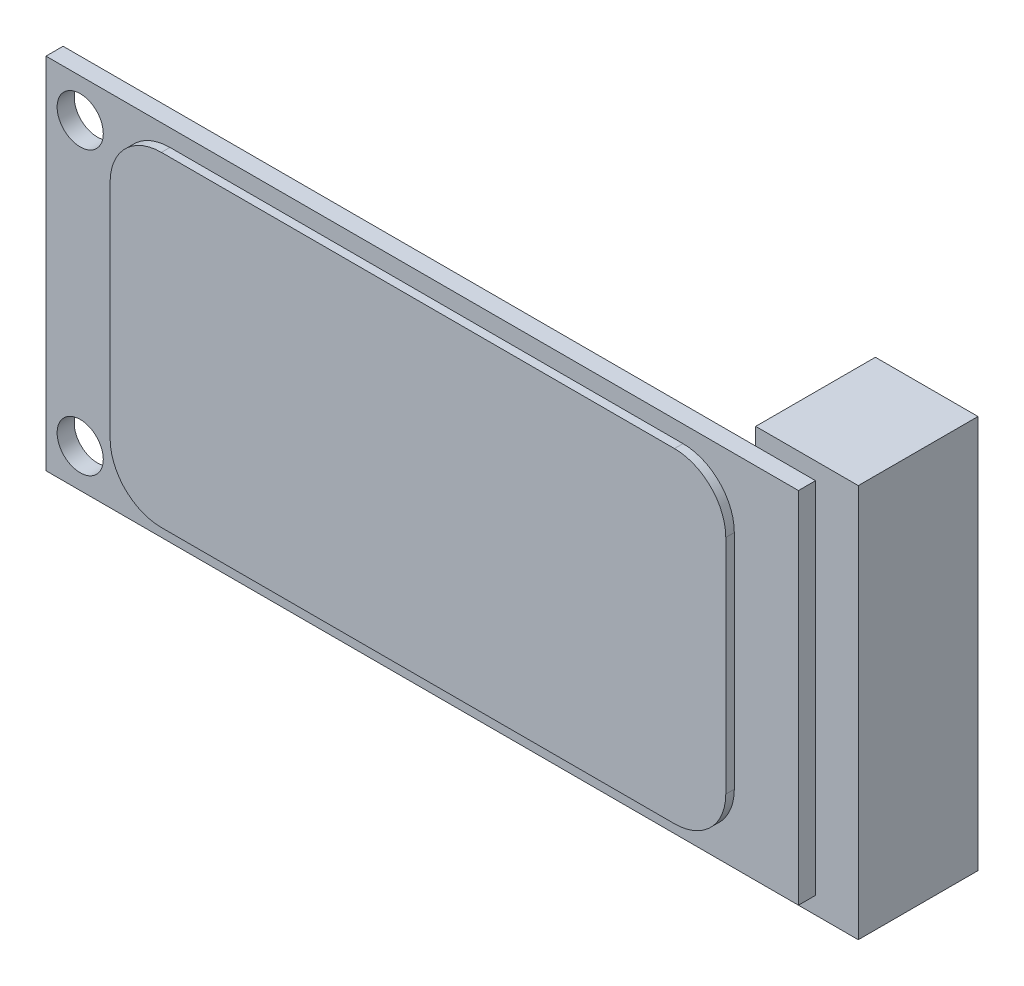
ISO-10303-21;
HEADER;
FILE_DESCRIPTION(('STEP AP214'),'2;1');
FILE_NAME('part.step','',(''),(''),'','','');
FILE_SCHEMA(('AUTOMOTIVE_DESIGN { 1 0 10303 214 1 1 1 1 }'));
ENDSEC;
DATA;
#1=APPLICATION_CONTEXT('core data for automotive mechanical design processes');
#2=APPLICATION_PROTOCOL_DEFINITION('international standard','automotive_design',2000,#1);
#3=PRODUCT_CONTEXT('',#1,'mechanical');
#4=PRODUCT('Part','Part','',(#3));
#5=PRODUCT_RELATED_PRODUCT_CATEGORY('part','',(#4));
#6=PRODUCT_DEFINITION_FORMATION('','',#4);
#7=PRODUCT_DEFINITION_CONTEXT('part definition',#1,'design');
#8=PRODUCT_DEFINITION('design','',#6,#7);
#9=PRODUCT_DEFINITION_SHAPE('','',#8);
#10=(LENGTH_UNIT() NAMED_UNIT(*) SI_UNIT(.MILLI.,.METRE.));
#11=(NAMED_UNIT(*) PLANE_ANGLE_UNIT() SI_UNIT($,.RADIAN.));
#12=(NAMED_UNIT(*) SI_UNIT($,.STERADIAN.) SOLID_ANGLE_UNIT());
#13=UNCERTAINTY_MEASURE_WITH_UNIT(LENGTH_MEASURE(1.E-05),#10,'distance_accuracy_value','');
#14=(GEOMETRIC_REPRESENTATION_CONTEXT(3) GLOBAL_UNCERTAINTY_ASSIGNED_CONTEXT((#13)) GLOBAL_UNIT_ASSIGNED_CONTEXT((#10,
#11,#12)) REPRESENTATION_CONTEXT('',''));
#15=CARTESIAN_POINT('',(0.,0.,0.));
#16=DIRECTION('',(0.,0.,1.));
#17=DIRECTION('',(1.,0.,0.));
#18=AXIS2_PLACEMENT_3D('',#15,#16,#17);
#19=CARTESIAN_POINT('',(0.,0.,0.));
#20=DIRECTION('',(0.,0.,1.));
#21=DIRECTION('',(1.,0.,0.));
#22=AXIS2_PLACEMENT_3D('',#19,#20,#21);
#23=PLANE('',#22);
#24=CARTESIAN_POINT('',(-20.,-8.25,0.));
#25=DIRECTION('',(0.,0.,1.));
#26=DIRECTION('',(1.,0.,0.));
#27=AXIS2_PLACEMENT_3D('',#24,#25,#26);
#28=CIRCLE('',#27,1.35000000000001);
#29=CARTESIAN_POINT('',(-18.65,-8.25,0.));
#30=VERTEX_POINT('',#29);
#31=EDGE_CURVE('E248',#30,#30,#28,.T.);
#32=ORIENTED_EDGE('',*,*,#31,.T.);
#33=EDGE_LOOP('',(#32));
#34=FACE_BOUND('',#33,.T.);
#35=CARTESIAN_POINT('',(-20.,8.24999999999999,0.));
#36=DIRECTION('',(0.,0.,1.));
#37=DIRECTION('',(1.,0.,0.));
#38=AXIS2_PLACEMENT_3D('',#35,#36,#37);
#39=CIRCLE('',#38,1.35);
#40=CARTESIAN_POINT('',(-18.65,8.24999999999999,0.));
#41=VERTEX_POINT('',#40);
#42=EDGE_CURVE('E218',#41,#41,#39,.T.);
#43=ORIENTED_EDGE('',*,*,#42,.T.);
#44=EDGE_LOOP('',(#43));
#45=FACE_BOUND('',#44,.T.);
#46=DIRECTION('',(0.,1.,0.));
#47=VECTOR('',#46,1.);
#48=CARTESIAN_POINT('',(18.5,11.5,0.));
#49=LINE('',#48,#47);
#50=CARTESIAN_POINT('',(18.5,-10.5,0.));
#51=VERTEX_POINT('',#50);
#52=CARTESIAN_POINT('',(18.5,10.5,0.));
#53=VERTEX_POINT('',#52);
#54=EDGE_CURVE('E11',#51,#53,#49,.T.);
#55=ORIENTED_EDGE('',*,*,#54,.F.);
#56=DIRECTION('',(-1.,0.,0.));
#57=VECTOR('',#56,1.);
#58=CARTESIAN_POINT('',(0.,-10.5,0.));
#59=LINE('',#58,#57);
#60=CARTESIAN_POINT('',(-22.,-10.5,0.));
#61=VERTEX_POINT('',#60);
#62=EDGE_CURVE('E254',#51,#61,#59,.T.);
#63=ORIENTED_EDGE('',*,*,#62,.T.);
#64=DIRECTION('',(0.,1.,0.));
#65=VECTOR('',#64,1.);
#66=CARTESIAN_POINT('',(-22.,0.,0.));
#67=LINE('',#66,#65);
#68=CARTESIAN_POINT('',(-22.,10.5,0.));
#69=VERTEX_POINT('',#68);
#70=EDGE_CURVE('E251',#61,#69,#67,.T.);
#71=ORIENTED_EDGE('',*,*,#70,.T.);
#72=DIRECTION('',(-1.,0.,0.));
#73=VECTOR('',#72,1.);
#74=CARTESIAN_POINT('',(0.,10.5,0.));
#75=LINE('',#74,#73);
#76=EDGE_CURVE('E261',#53,#69,#75,.T.);
#77=ORIENTED_EDGE('',*,*,#76,.F.);
#78=EDGE_LOOP('',(#55,#63,#71,#77));
#79=FACE_BOUND('',#78,.T.);
#80=ADVANCED_FACE('F51',(#34,#45,#79),#23,.F.);
#81=CARTESIAN_POINT('',(-22.,0.,1.));
#82=DIRECTION('',(-1.,0.,0.));
#83=DIRECTION('',(0.,0.,1.));
#84=AXIS2_PLACEMENT_3D('',#81,#82,#83);
#85=PLANE('',#84);
#86=ORIENTED_EDGE('',*,*,#70,.F.);
#87=DIRECTION('',(0.,0.,-1.));
#88=VECTOR('',#87,1.);
#89=CARTESIAN_POINT('',(-22.,-10.5,1.));
#90=LINE('',#89,#88);
#91=CARTESIAN_POINT('',(-22.,-10.5,1.));
#92=VERTEX_POINT('',#91);
#93=EDGE_CURVE('E269',#92,#61,#90,.T.);
#94=ORIENTED_EDGE('',*,*,#93,.F.);
#95=DIRECTION('',(0.,1.,0.));
#96=VECTOR('',#95,1.);
#97=CARTESIAN_POINT('',(-22.,0.,1.));
#98=LINE('',#97,#96);
#99=CARTESIAN_POINT('',(-22.,10.5,1.));
#100=VERTEX_POINT('',#99);
#101=EDGE_CURVE('E234',#92,#100,#98,.T.);
#102=ORIENTED_EDGE('',*,*,#101,.T.);
#103=DIRECTION('',(0.,0.,-1.));
#104=VECTOR('',#103,1.);
#105=CARTESIAN_POINT('',(-22.,10.5,1.));
#106=LINE('',#105,#104);
#107=EDGE_CURVE('E245',#100,#69,#106,.T.);
#108=ORIENTED_EDGE('',*,*,#107,.T.);
#109=EDGE_LOOP('',(#86,#94,#102,#108));
#110=FACE_BOUND('',#109,.T.);
#111=ADVANCED_FACE('F351',(#110),#85,.T.);
#112=CARTESIAN_POINT('',(0.,-10.5,1.));
#113=DIRECTION('',(0.,-1.,0.));
#114=DIRECTION('',(0.,0.,-1.));
#115=AXIS2_PLACEMENT_3D('',#112,#113,#114);
#116=PLANE('',#115);
#117=CARTESIAN_POINT('',(22.,-10.5,0.));
#118=VERTEX_POINT('',#117);
#119=EDGE_CURVE('E255',#118,#51,#59,.T.);
#120=ORIENTED_EDGE('',*,*,#119,.F.);
#121=DIRECTION('',(0.,0.,-1.));
#122=VECTOR('',#121,1.);
#123=CARTESIAN_POINT('',(22.,-10.5,1.));
#124=LINE('',#123,#122);
#125=CARTESIAN_POINT('',(22.,-10.5,1.));
#126=VERTEX_POINT('',#125);
#127=EDGE_CURVE('E267',#126,#118,#124,.T.);
#128=ORIENTED_EDGE('',*,*,#127,.F.);
#129=DIRECTION('',(-1.,0.,0.));
#130=VECTOR('',#129,1.);
#131=CARTESIAN_POINT('',(0.,-10.5,1.));
#132=LINE('',#131,#130);
#133=EDGE_CURVE('E237',#126,#92,#132,.T.);
#134=ORIENTED_EDGE('',*,*,#133,.T.);
#135=ORIENTED_EDGE('',*,*,#93,.T.);
#136=ORIENTED_EDGE('',*,*,#62,.F.);
#137=EDGE_LOOP('',(#120,#128,#134,#135,#136));
#138=FACE_BOUND('',#137,.T.);
#139=ADVANCED_FACE('F359',(#138),#116,.T.);
#140=CARTESIAN_POINT('',(22.,0.,1.));
#141=DIRECTION('',(-1.,0.,0.));
#142=DIRECTION('',(0.,0.,1.));
#143=AXIS2_PLACEMENT_3D('',#140,#141,#142);
#144=PLANE('',#143);
#145=DIRECTION('',(0.,1.,0.));
#146=VECTOR('',#145,1.);
#147=CARTESIAN_POINT('',(22.,0.,0.));
#148=LINE('',#147,#146);
#149=CARTESIAN_POINT('',(22.,10.5,0.));
#150=VERTEX_POINT('',#149);
#151=EDGE_CURVE('E258',#118,#150,#148,.T.);
#152=ORIENTED_EDGE('',*,*,#151,.T.);
#153=DIRECTION('',(0.,0.,-1.));
#154=VECTOR('',#153,1.);
#155=CARTESIAN_POINT('',(22.,10.5,1.));
#156=LINE('',#155,#154);
#157=CARTESIAN_POINT('',(22.,10.5,1.));
#158=VERTEX_POINT('',#157);
#159=EDGE_CURVE('E265',#158,#150,#156,.T.);
#160=ORIENTED_EDGE('',*,*,#159,.F.);
#161=DIRECTION('',(0.,1.,0.));
#162=VECTOR('',#161,1.);
#163=CARTESIAN_POINT('',(22.,0.,1.));
#164=LINE('',#163,#162);
#165=EDGE_CURVE('E240',#126,#158,#164,.T.);
#166=ORIENTED_EDGE('',*,*,#165,.F.);
#167=ORIENTED_EDGE('',*,*,#127,.T.);
#168=EDGE_LOOP('',(#152,#160,#166,#167));
#169=FACE_BOUND('',#168,.T.);
#170=ADVANCED_FACE('F371',(#169),#144,.F.);
#171=CARTESIAN_POINT('',(-20.,-8.25,1.));
#172=DIRECTION('',(0.,0.,-1.));
#173=DIRECTION('',(-1.,0.,0.));
#174=AXIS2_PLACEMENT_3D('',#171,#172,#173);
#175=CYLINDRICAL_SURFACE('',#174,1.35000000000001);
#176=CARTESIAN_POINT('',(-20.,-8.25,1.));
#177=DIRECTION('',(0.,0.,1.));
#178=DIRECTION('',(1.,0.,0.));
#179=AXIS2_PLACEMENT_3D('',#176,#177,#178);
#180=CIRCLE('',#179,1.35000000000001);
#181=CARTESIAN_POINT('',(-18.65,-8.25,1.));
#182=VERTEX_POINT('',#181);
#183=EDGE_CURVE('E230',#182,#182,#180,.T.);
#184=ORIENTED_EDGE('',*,*,#183,.T.);
#185=EDGE_LOOP('',(#184));
#186=FACE_BOUND('',#185,.T.);
#187=ORIENTED_EDGE('',*,*,#31,.F.);
#188=EDGE_LOOP('',(#187));
#189=FACE_BOUND('',#188,.T.);
#190=ADVANCED_FACE('F374',(#186,#189),#175,.F.);
#191=CARTESIAN_POINT('',(-20.,8.24999999999999,1.));
#192=DIRECTION('',(0.,0.,-1.));
#193=DIRECTION('',(-1.,0.,0.));
#194=AXIS2_PLACEMENT_3D('',#191,#192,#193);
#195=CYLINDRICAL_SURFACE('',#194,1.35);
#196=CARTESIAN_POINT('',(-20.,8.24999999999999,1.));
#197=DIRECTION('',(0.,0.,1.));
#198=DIRECTION('',(1.,0.,0.));
#199=AXIS2_PLACEMENT_3D('',#196,#197,#198);
#200=CIRCLE('',#199,1.35);
#201=CARTESIAN_POINT('',(-18.65,8.24999999999999,1.));
#202=VERTEX_POINT('',#201);
#203=EDGE_CURVE('E227',#202,#202,#200,.T.);
#204=ORIENTED_EDGE('',*,*,#203,.T.);
#205=EDGE_LOOP('',(#204));
#206=FACE_BOUND('',#205,.T.);
#207=ORIENTED_EDGE('',*,*,#42,.F.);
#208=EDGE_LOOP('',(#207));
#209=FACE_BOUND('',#208,.T.);
#210=ADVANCED_FACE('F369',(#206,#209),#195,.F.);
#211=CARTESIAN_POINT('',(0.,10.5,1.));
#212=DIRECTION('',(0.,-1.,0.));
#213=DIRECTION('',(0.,0.,-1.));
#214=AXIS2_PLACEMENT_3D('',#211,#212,#213);
#215=PLANE('',#214);
#216=EDGE_CURVE('E231',#150,#53,#75,.T.);
#217=ORIENTED_EDGE('',*,*,#216,.T.);
#218=ORIENTED_EDGE('',*,*,#76,.T.);
#219=ORIENTED_EDGE('',*,*,#107,.F.);
#220=DIRECTION('',(-1.,0.,0.));
#221=VECTOR('',#220,1.);
#222=CARTESIAN_POINT('',(0.,10.5,1.));
#223=LINE('',#222,#221);
#224=EDGE_CURVE('E243',#158,#100,#223,.T.);
#225=ORIENTED_EDGE('',*,*,#224,.F.);
#226=ORIENTED_EDGE('',*,*,#159,.T.);
#227=EDGE_LOOP('',(#217,#218,#219,#225,#226));
#228=FACE_BOUND('',#227,.T.);
#229=ADVANCED_FACE('F366',(#228),#215,.F.);
#230=CARTESIAN_POINT('',(0.,0.,1.));
#231=DIRECTION('',(0.,0.,1.));
#232=DIRECTION('',(1.,0.,0.));
#233=AXIS2_PLACEMENT_3D('',#230,#231,#232);
#234=PLANE('',#233);
#235=DIRECTION('',(0.,1.,0.));
#236=VECTOR('',#235,1.);
#237=CARTESIAN_POINT('',(-17.75,-9.50000000000001,1.));
#238=LINE('',#237,#236);
#239=CARTESIAN_POINT('',(-17.75,-6.50000000000001,1.));
#240=VERTEX_POINT('',#239);
#241=CARTESIAN_POINT('',(-17.75,6.5,1.));
#242=VERTEX_POINT('',#241);
#243=EDGE_CURVE('E210',#240,#242,#238,.T.);
#244=ORIENTED_EDGE('',*,*,#243,.T.);
#245=CARTESIAN_POINT('',(-14.75,6.5,1.));
#246=DIRECTION('',(0.,0.,1.));
#247=DIRECTION('',(1.,0.,0.));
#248=AXIS2_PLACEMENT_3D('',#245,#246,#247);
#249=CIRCLE('',#248,3.);
#250=CARTESIAN_POINT('',(-14.75,9.49999999999999,1.));
#251=VERTEX_POINT('',#250);
#252=EDGE_CURVE('E55',#242,#251,#249,.F.);
#253=ORIENTED_EDGE('',*,*,#252,.T.);
#254=DIRECTION('',(1.,0.,0.));
#255=VECTOR('',#254,1.);
#256=CARTESIAN_POINT('',(-17.75,9.49999999999999,1.));
#257=LINE('',#256,#255);
#258=CARTESIAN_POINT('',(15.25,9.49999999999999,1.));
#259=VERTEX_POINT('',#258);
#260=EDGE_CURVE('E197',#251,#259,#257,.T.);
#261=ORIENTED_EDGE('',*,*,#260,.T.);
#262=CARTESIAN_POINT('',(15.25,6.49999999999999,1.));
#263=DIRECTION('',(0.,0.,1.));
#264=DIRECTION('',(1.,0.,0.));
#265=AXIS2_PLACEMENT_3D('',#262,#263,#264);
#266=CIRCLE('',#265,3.);
#267=CARTESIAN_POINT('',(18.25,6.5,1.));
#268=VERTEX_POINT('',#267);
#269=EDGE_CURVE('E299',#259,#268,#266,.F.);
#270=ORIENTED_EDGE('',*,*,#269,.T.);
#271=DIRECTION('',(0.,1.,0.));
#272=VECTOR('',#271,1.);
#273=CARTESIAN_POINT('',(18.25,-9.50000000000001,1.));
#274=LINE('',#273,#272);
#275=CARTESIAN_POINT('',(18.25,-6.50000000000001,1.));
#276=VERTEX_POINT('',#275);
#277=EDGE_CURVE('E200',#276,#268,#274,.T.);
#278=ORIENTED_EDGE('',*,*,#277,.F.);
#279=CARTESIAN_POINT('',(15.25,-6.50000000000001,1.));
#280=DIRECTION('',(0.,0.,1.));
#281=DIRECTION('',(1.,0.,0.));
#282=AXIS2_PLACEMENT_3D('',#279,#280,#281);
#283=CIRCLE('',#282,3.);
#284=CARTESIAN_POINT('',(15.25,-9.50000000000001,1.));
#285=VERTEX_POINT('',#284);
#286=EDGE_CURVE('E301',#276,#285,#283,.F.);
#287=ORIENTED_EDGE('',*,*,#286,.T.);
#288=DIRECTION('',(1.,0.,0.));
#289=VECTOR('',#288,1.);
#290=CARTESIAN_POINT('',(-17.75,-9.50000000000001,1.));
#291=LINE('',#290,#289);
#292=CARTESIAN_POINT('',(-14.75,-9.50000000000001,1.));
#293=VERTEX_POINT('',#292);
#294=EDGE_CURVE('E222',#293,#285,#291,.T.);
#295=ORIENTED_EDGE('',*,*,#294,.F.);
#296=CARTESIAN_POINT('',(-14.75,-6.50000000000001,1.));
#297=DIRECTION('',(0.,0.,1.));
#298=DIRECTION('',(1.,0.,0.));
#299=AXIS2_PLACEMENT_3D('',#296,#297,#298);
#300=CIRCLE('',#299,3.);
#301=EDGE_CURVE('E302',#293,#240,#300,.F.);
#302=ORIENTED_EDGE('',*,*,#301,.T.);
#303=EDGE_LOOP('',(#244,#253,#261,#270,#278,#287,#295,#302));
#304=FACE_BOUND('',#303,.T.);
#305=ORIENTED_EDGE('',*,*,#203,.F.);
#306=EDGE_LOOP('',(#305));
#307=FACE_BOUND('',#306,.T.);
#308=ORIENTED_EDGE('',*,*,#183,.F.);
#309=EDGE_LOOP('',(#308));
#310=FACE_BOUND('',#309,.T.);
#311=ORIENTED_EDGE('',*,*,#101,.F.);
#312=ORIENTED_EDGE('',*,*,#133,.F.);
#313=ORIENTED_EDGE('',*,*,#165,.T.);
#314=ORIENTED_EDGE('',*,*,#224,.T.);
#315=EDGE_LOOP('',(#311,#312,#313,#314));
#316=FACE_BOUND('',#315,.T.);
#317=ADVANCED_FACE('F307',(#304,#307,#310,#316),#234,.T.);
#318=CARTESIAN_POINT('',(-17.75,9.49999999999999,1.5));
#319=DIRECTION('',(0.,1.,0.));
#320=DIRECTION('',(0.,0.,1.));
#321=AXIS2_PLACEMENT_3D('',#318,#319,#320);
#322=PLANE('',#321);
#323=DIRECTION('',(1.,0.,0.));
#324=VECTOR('',#323,1.);
#325=CARTESIAN_POINT('',(-17.75,9.49999999999999,1.5));
#326=LINE('',#325,#324);
#327=CARTESIAN_POINT('',(-14.75,9.49999999999999,1.5));
#328=VERTEX_POINT('',#327);
#329=CARTESIAN_POINT('',(15.25,9.49999999999999,1.5));
#330=VERTEX_POINT('',#329);
#331=EDGE_CURVE('E206',#328,#330,#326,.T.);
#332=ORIENTED_EDGE('',*,*,#331,.T.);
#333=DIRECTION('',(0.,0.,-1.));
#334=VECTOR('',#333,1.);
#335=CARTESIAN_POINT('',(15.25,9.49999999999999,1.));
#336=LINE('',#335,#334);
#337=EDGE_CURVE('E274',#330,#259,#336,.T.);
#338=ORIENTED_EDGE('',*,*,#337,.T.);
#339=ORIENTED_EDGE('',*,*,#260,.F.);
#340=DIRECTION('',(0.,0.,-1.));
#341=VECTOR('',#340,1.);
#342=CARTESIAN_POINT('',(-14.75,9.49999999999999,1.5));
#343=LINE('',#342,#341);
#344=EDGE_CURVE('E272',#251,#328,#343,.F.);
#345=ORIENTED_EDGE('',*,*,#344,.T.);
#346=EDGE_LOOP('',(#332,#338,#339,#345));
#347=FACE_BOUND('',#346,.T.);
#348=ADVANCED_FACE('F310',(#347),#322,.T.);
#349=CARTESIAN_POINT('',(-17.75,-9.50000000000001,1.5));
#350=DIRECTION('',(-1.,0.,0.));
#351=DIRECTION('',(0.,0.,1.));
#352=AXIS2_PLACEMENT_3D('',#349,#350,#351);
#353=PLANE('',#352);
#354=ORIENTED_EDGE('',*,*,#243,.F.);
#355=DIRECTION('',(0.,0.,-1.));
#356=VECTOR('',#355,1.);
#357=CARTESIAN_POINT('',(-17.75,-6.50000000000001,1.5));
#358=LINE('',#357,#356);
#359=CARTESIAN_POINT('',(-17.75,-6.50000000000001,1.5));
#360=VERTEX_POINT('',#359);
#361=EDGE_CURVE('E297',#240,#360,#358,.F.);
#362=ORIENTED_EDGE('',*,*,#361,.T.);
#363=DIRECTION('',(0.,1.,0.));
#364=VECTOR('',#363,1.);
#365=CARTESIAN_POINT('',(-17.75,-9.50000000000001,1.5));
#366=LINE('',#365,#364);
#367=CARTESIAN_POINT('',(-17.75,6.5,1.5));
#368=VERTEX_POINT('',#367);
#369=EDGE_CURVE('E216',#360,#368,#366,.T.);
#370=ORIENTED_EDGE('',*,*,#369,.T.);
#371=DIRECTION('',(0.,0.,-1.));
#372=VECTOR('',#371,1.);
#373=CARTESIAN_POINT('',(-17.75,6.5,1.5));
#374=LINE('',#373,#372);
#375=EDGE_CURVE('E295',#368,#242,#374,.T.);
#376=ORIENTED_EDGE('',*,*,#375,.T.);
#377=EDGE_LOOP('',(#354,#362,#370,#376));
#378=FACE_BOUND('',#377,.T.);
#379=ADVANCED_FACE('F319',(#378),#353,.T.);
#380=CARTESIAN_POINT('',(-17.75,-9.50000000000001,1.5));
#381=DIRECTION('',(0.,1.,0.));
#382=DIRECTION('',(0.,0.,1.));
#383=AXIS2_PLACEMENT_3D('',#380,#381,#382);
#384=PLANE('',#383);
#385=ORIENTED_EDGE('',*,*,#294,.T.);
#386=DIRECTION('',(0.,0.,-1.));
#387=VECTOR('',#386,1.);
#388=CARTESIAN_POINT('',(15.25,-9.50000000000001,1.5));
#389=LINE('',#388,#387);
#390=CARTESIAN_POINT('',(15.25,-9.50000000000001,1.5));
#391=VERTEX_POINT('',#390);
#392=EDGE_CURVE('E293',#285,#391,#389,.F.);
#393=ORIENTED_EDGE('',*,*,#392,.T.);
#394=DIRECTION('',(1.,0.,0.));
#395=VECTOR('',#394,1.);
#396=CARTESIAN_POINT('',(-17.75,-9.50000000000001,1.5));
#397=LINE('',#396,#395);
#398=CARTESIAN_POINT('',(-14.75,-9.50000000000001,1.5));
#399=VERTEX_POINT('',#398);
#400=EDGE_CURVE('E213',#399,#391,#397,.T.);
#401=ORIENTED_EDGE('',*,*,#400,.F.);
#402=DIRECTION('',(0.,0.,-1.));
#403=VECTOR('',#402,1.);
#404=CARTESIAN_POINT('',(-14.75,-9.50000000000001,1.));
#405=LINE('',#404,#403);
#406=EDGE_CURVE('E290',#399,#293,#405,.T.);
#407=ORIENTED_EDGE('',*,*,#406,.T.);
#408=EDGE_LOOP('',(#385,#393,#401,#407));
#409=FACE_BOUND('',#408,.T.);
#410=ADVANCED_FACE('F327',(#409),#384,.F.);
#411=CARTESIAN_POINT('',(18.25,-9.50000000000001,1.5));
#412=DIRECTION('',(-1.,0.,0.));
#413=DIRECTION('',(0.,0.,1.));
#414=AXIS2_PLACEMENT_3D('',#411,#412,#413);
#415=PLANE('',#414);
#416=ORIENTED_EDGE('',*,*,#277,.T.);
#417=DIRECTION('',(0.,0.,-1.));
#418=VECTOR('',#417,1.);
#419=CARTESIAN_POINT('',(18.25,6.49999999999999,1.5));
#420=LINE('',#419,#418);
#421=CARTESIAN_POINT('',(18.25,6.5,1.5));
#422=VERTEX_POINT('',#421);
#423=EDGE_CURVE('E280',#268,#422,#420,.F.);
#424=ORIENTED_EDGE('',*,*,#423,.T.);
#425=DIRECTION('',(0.,1.,0.));
#426=VECTOR('',#425,1.);
#427=CARTESIAN_POINT('',(18.25,-9.50000000000001,1.5));
#428=LINE('',#427,#426);
#429=CARTESIAN_POINT('',(18.25,-6.50000000000001,1.5));
#430=VERTEX_POINT('',#429);
#431=EDGE_CURVE('E209',#430,#422,#428,.T.);
#432=ORIENTED_EDGE('',*,*,#431,.F.);
#433=DIRECTION('',(0.,0.,-1.));
#434=VECTOR('',#433,1.);
#435=CARTESIAN_POINT('',(18.25,-6.50000000000001,1.5));
#436=LINE('',#435,#434);
#437=EDGE_CURVE('E277',#430,#276,#436,.T.);
#438=ORIENTED_EDGE('',*,*,#437,.T.);
#439=EDGE_LOOP('',(#416,#424,#432,#438));
#440=FACE_BOUND('',#439,.T.);
#441=ADVANCED_FACE('F335',(#440),#415,.F.);
#442=CARTESIAN_POINT('',(0.,0.,1.5));
#443=DIRECTION('',(0.,0.,1.));
#444=DIRECTION('',(1.,0.,0.));
#445=AXIS2_PLACEMENT_3D('',#442,#443,#444);
#446=PLANE('',#445);
#447=ORIENTED_EDGE('',*,*,#431,.T.);
#448=CARTESIAN_POINT('',(15.25,6.49999999999999,1.5));
#449=DIRECTION('',(0.,0.,1.));
#450=DIRECTION('',(1.,0.,0.));
#451=AXIS2_PLACEMENT_3D('',#448,#449,#450);
#452=CIRCLE('',#451,3.);
#453=EDGE_CURVE('E288',#422,#330,#452,.T.);
#454=ORIENTED_EDGE('',*,*,#453,.T.);
#455=ORIENTED_EDGE('',*,*,#331,.F.);
#456=CARTESIAN_POINT('',(-14.75,6.5,1.5));
#457=DIRECTION('',(0.,0.,1.));
#458=DIRECTION('',(1.,0.,0.));
#459=AXIS2_PLACEMENT_3D('',#456,#457,#458);
#460=CIRCLE('',#459,3.);
#461=EDGE_CURVE('E282',#328,#368,#460,.T.);
#462=ORIENTED_EDGE('',*,*,#461,.T.);
#463=ORIENTED_EDGE('',*,*,#369,.F.);
#464=CARTESIAN_POINT('',(-14.75,-6.50000000000001,1.5));
#465=DIRECTION('',(0.,0.,1.));
#466=DIRECTION('',(1.,0.,0.));
#467=AXIS2_PLACEMENT_3D('',#464,#465,#466);
#468=CIRCLE('',#467,3.);
#469=EDGE_CURVE('E284',#360,#399,#468,.T.);
#470=ORIENTED_EDGE('',*,*,#469,.T.);
#471=ORIENTED_EDGE('',*,*,#400,.T.);
#472=CARTESIAN_POINT('',(15.25,-6.50000000000001,1.5));
#473=DIRECTION('',(0.,0.,1.));
#474=DIRECTION('',(1.,0.,0.));
#475=AXIS2_PLACEMENT_3D('',#472,#473,#474);
#476=CIRCLE('',#475,3.);
#477=EDGE_CURVE('E286',#391,#430,#476,.T.);
#478=ORIENTED_EDGE('',*,*,#477,.T.);
#479=EDGE_LOOP('',(#447,#454,#455,#462,#463,#470,#471,#478));
#480=FACE_BOUND('',#479,.T.);
#481=ADVANCED_FACE('F316',(#480),#446,.T.);
#482=CARTESIAN_POINT('',(15.25,6.49999999999999,1.5));
#483=DIRECTION('',(0.,0.,1.));
#484=DIRECTION('',(1.,0.,0.));
#485=AXIS2_PLACEMENT_3D('',#482,#483,#484);
#486=CYLINDRICAL_SURFACE('',#485,3.);
#487=ORIENTED_EDGE('',*,*,#453,.F.);
#488=ORIENTED_EDGE('',*,*,#423,.F.);
#489=ORIENTED_EDGE('',*,*,#269,.F.);
#490=ORIENTED_EDGE('',*,*,#337,.F.);
#491=EDGE_LOOP('',(#487,#488,#489,#490));
#492=FACE_BOUND('',#491,.T.);
#493=ADVANCED_FACE('F339',(#492),#486,.T.);
#494=CARTESIAN_POINT('',(15.25,-6.50000000000001,1.5));
#495=DIRECTION('',(0.,0.,-1.));
#496=DIRECTION('',(-1.,0.,0.));
#497=AXIS2_PLACEMENT_3D('',#494,#495,#496);
#498=CYLINDRICAL_SURFACE('',#497,3.);
#499=ORIENTED_EDGE('',*,*,#477,.F.);
#500=ORIENTED_EDGE('',*,*,#392,.F.);
#501=ORIENTED_EDGE('',*,*,#286,.F.);
#502=ORIENTED_EDGE('',*,*,#437,.F.);
#503=EDGE_LOOP('',(#499,#500,#501,#502));
#504=FACE_BOUND('',#503,.T.);
#505=ADVANCED_FACE('F330',(#504),#498,.T.);
#506=CARTESIAN_POINT('',(-14.75,-6.50000000000001,1.5));
#507=DIRECTION('',(0.,0.,1.));
#508=DIRECTION('',(1.,0.,0.));
#509=AXIS2_PLACEMENT_3D('',#506,#507,#508);
#510=CYLINDRICAL_SURFACE('',#509,3.);
#511=ORIENTED_EDGE('',*,*,#469,.F.);
#512=ORIENTED_EDGE('',*,*,#361,.F.);
#513=ORIENTED_EDGE('',*,*,#301,.F.);
#514=ORIENTED_EDGE('',*,*,#406,.F.);
#515=EDGE_LOOP('',(#511,#512,#513,#514));
#516=FACE_BOUND('',#515,.T.);
#517=ADVANCED_FACE('F322',(#516),#510,.T.);
#518=CARTESIAN_POINT('',(-14.75,6.5,1.5));
#519=DIRECTION('',(0.,0.,-1.));
#520=DIRECTION('',(-1.,0.,0.));
#521=AXIS2_PLACEMENT_3D('',#518,#519,#520);
#522=CYLINDRICAL_SURFACE('',#521,3.);
#523=ORIENTED_EDGE('',*,*,#461,.F.);
#524=ORIENTED_EDGE('',*,*,#344,.F.);
#525=ORIENTED_EDGE('',*,*,#252,.F.);
#526=ORIENTED_EDGE('',*,*,#375,.F.);
#527=EDGE_LOOP('',(#523,#524,#525,#526));
#528=FACE_BOUND('',#527,.T.);
#529=ADVANCED_FACE('F53',(#528),#522,.T.);
#530=CARTESIAN_POINT('',(24.5,11.5,-7.));
#531=DIRECTION('',(-1.,0.,0.));
#532=DIRECTION('',(0.,-1.,0.));
#533=AXIS2_PLACEMENT_3D('',#530,#531,#532);
#534=PLANE('',#533);
#535=DIRECTION('',(0.,-1.,0.));
#536=VECTOR('',#535,1.);
#537=CARTESIAN_POINT('',(24.5,11.5,0.));
#538=LINE('',#537,#536);
#539=CARTESIAN_POINT('',(24.5,11.5,0.));
#540=VERTEX_POINT('',#539);
#541=CARTESIAN_POINT('',(24.5,-11.5,0.));
#542=VERTEX_POINT('',#541);
#543=EDGE_CURVE('E196',#540,#542,#538,.T.);
#544=ORIENTED_EDGE('',*,*,#543,.T.);
#545=DIRECTION('',(0.,0.,1.));
#546=VECTOR('',#545,1.);
#547=CARTESIAN_POINT('',(24.5,-11.5,-7.));
#548=LINE('',#547,#546);
#549=CARTESIAN_POINT('',(24.5,-11.5,-7.));
#550=VERTEX_POINT('',#549);
#551=EDGE_CURVE('E176',#550,#542,#548,.T.);
#552=ORIENTED_EDGE('',*,*,#551,.F.);
#553=DIRECTION('',(0.,-1.,0.));
#554=VECTOR('',#553,1.);
#555=CARTESIAN_POINT('',(24.5,11.5,-7.));
#556=LINE('',#555,#554);
#557=CARTESIAN_POINT('',(24.5,11.5,-7.));
#558=VERTEX_POINT('',#557);
#559=EDGE_CURVE('E183',#558,#550,#556,.T.);
#560=ORIENTED_EDGE('',*,*,#559,.F.);
#561=DIRECTION('',(0.,0.,1.));
#562=VECTOR('',#561,1.);
#563=CARTESIAN_POINT('',(24.5,11.5,-7.));
#564=LINE('',#563,#562);
#565=EDGE_CURVE('E412',#558,#540,#564,.T.);
#566=ORIENTED_EDGE('',*,*,#565,.T.);
#567=EDGE_LOOP('',(#544,#552,#560,#566));
#568=FACE_BOUND('',#567,.T.);
#569=ADVANCED_FACE('F194',(#568),#534,.F.);
#570=CARTESIAN_POINT('',(24.5,-11.5,-7.));
#571=DIRECTION('',(0.,1.,0.));
#572=DIRECTION('',(0.,0.,1.));
#573=AXIS2_PLACEMENT_3D('',#570,#571,#572);
#574=PLANE('',#573);
#575=DIRECTION('',(-1.,0.,0.));
#576=VECTOR('',#575,1.);
#577=CARTESIAN_POINT('',(24.5,-11.5,0.));
#578=LINE('',#577,#576);
#579=CARTESIAN_POINT('',(18.5,-11.5,0.));
#580=VERTEX_POINT('',#579);
#581=EDGE_CURVE('E408',#542,#580,#578,.T.);
#582=ORIENTED_EDGE('',*,*,#581,.T.);
#583=DIRECTION('',(0.,0.,1.));
#584=VECTOR('',#583,1.);
#585=CARTESIAN_POINT('',(18.5,-11.5,-7.));
#586=LINE('',#585,#584);
#587=CARTESIAN_POINT('',(18.5,-11.5,-7.));
#588=VERTEX_POINT('',#587);
#589=EDGE_CURVE('E179',#588,#580,#586,.T.);
#590=ORIENTED_EDGE('',*,*,#589,.F.);
#591=DIRECTION('',(-1.,0.,0.));
#592=VECTOR('',#591,1.);
#593=CARTESIAN_POINT('',(24.5,-11.5,-7.));
#594=LINE('',#593,#592);
#595=EDGE_CURVE('E172',#550,#588,#594,.T.);
#596=ORIENTED_EDGE('',*,*,#595,.F.);
#597=ORIENTED_EDGE('',*,*,#551,.T.);
#598=EDGE_LOOP('',(#582,#590,#596,#597));
#599=FACE_BOUND('',#598,.T.);
#600=ADVANCED_FACE('F174',(#599),#574,.F.);
#601=CARTESIAN_POINT('',(18.5,11.5,-7.));
#602=DIRECTION('',(1.,0.,0.));
#603=DIRECTION('',(0.,1.,0.));
#604=AXIS2_PLACEMENT_3D('',#601,#602,#603);
#605=PLANE('',#604);
#606=EDGE_CURVE('E61',#580,#51,#49,.T.);
#607=ORIENTED_EDGE('',*,*,#606,.T.);
#608=ORIENTED_EDGE('',*,*,#54,.T.);
#609=CARTESIAN_POINT('',(18.5,11.5,0.));
#610=VERTEX_POINT('',#609);
#611=EDGE_CURVE('E62',#53,#610,#49,.T.);
#612=ORIENTED_EDGE('',*,*,#611,.T.);
#613=DIRECTION('',(0.,0.,1.));
#614=VECTOR('',#613,1.);
#615=CARTESIAN_POINT('',(18.5,11.5,-7.));
#616=LINE('',#615,#614);
#617=CARTESIAN_POINT('',(18.5,11.5,-7.));
#618=VERTEX_POINT('',#617);
#619=EDGE_CURVE('E202',#618,#610,#616,.T.);
#620=ORIENTED_EDGE('',*,*,#619,.F.);
#621=DIRECTION('',(0.,1.,0.));
#622=VECTOR('',#621,1.);
#623=CARTESIAN_POINT('',(18.5,11.5,-7.));
#624=LINE('',#623,#622);
#625=EDGE_CURVE('E182',#588,#618,#624,.T.);
#626=ORIENTED_EDGE('',*,*,#625,.F.);
#627=ORIENTED_EDGE('',*,*,#589,.T.);
#628=EDGE_LOOP('',(#607,#608,#612,#620,#626,#627));
#629=FACE_BOUND('',#628,.T.);
#630=ADVANCED_FACE('F406',(#629),#605,.F.);
#631=CARTESIAN_POINT('',(24.5,11.5,-7.));
#632=DIRECTION('',(0.,-1.,0.));
#633=DIRECTION('',(1.,0.,0.));
#634=AXIS2_PLACEMENT_3D('',#631,#632,#633);
#635=PLANE('',#634);
#636=DIRECTION('',(1.,0.,0.));
#637=VECTOR('',#636,1.);
#638=CARTESIAN_POINT('',(24.5,11.5,0.));
#639=LINE('',#638,#637);
#640=EDGE_CURVE('E192',#610,#540,#639,.T.);
#641=ORIENTED_EDGE('',*,*,#640,.T.);
#642=ORIENTED_EDGE('',*,*,#565,.F.);
#643=DIRECTION('',(1.,0.,0.));
#644=VECTOR('',#643,1.);
#645=CARTESIAN_POINT('',(24.5,11.5,-7.));
#646=LINE('',#645,#644);
#647=EDGE_CURVE('E188',#618,#558,#646,.T.);
#648=ORIENTED_EDGE('',*,*,#647,.F.);
#649=ORIENTED_EDGE('',*,*,#619,.T.);
#650=EDGE_LOOP('',(#641,#642,#648,#649));
#651=FACE_BOUND('',#650,.T.);
#652=ADVANCED_FACE('F417',(#651),#635,.F.);
#653=CARTESIAN_POINT('',(0.,0.,-7.));
#654=DIRECTION('',(0.,0.,-1.));
#655=DIRECTION('',(-1.,0.,0.));
#656=AXIS2_PLACEMENT_3D('',#653,#654,#655);
#657=PLANE('',#656);
#658=ORIENTED_EDGE('',*,*,#559,.T.);
#659=ORIENTED_EDGE('',*,*,#595,.T.);
#660=ORIENTED_EDGE('',*,*,#625,.T.);
#661=ORIENTED_EDGE('',*,*,#647,.T.);
#662=EDGE_LOOP('',(#658,#659,#660,#661));
#663=FACE_BOUND('',#662,.T.);
#664=ADVANCED_FACE('F186',(#663),#657,.T.);
#665=CARTESIAN_POINT('',(0.,0.,0.));
#666=DIRECTION('',(0.,0.,-1.));
#667=DIRECTION('',(-1.,0.,0.));
#668=AXIS2_PLACEMENT_3D('',#665,#666,#667);
#669=PLANE('',#668);
#670=ORIENTED_EDGE('',*,*,#216,.F.);
#671=ORIENTED_EDGE('',*,*,#151,.F.);
#672=ORIENTED_EDGE('',*,*,#119,.T.);
#673=ORIENTED_EDGE('',*,*,#606,.F.);
#674=ORIENTED_EDGE('',*,*,#581,.F.);
#675=ORIENTED_EDGE('',*,*,#543,.F.);
#676=ORIENTED_EDGE('',*,*,#640,.F.);
#677=ORIENTED_EDGE('',*,*,#611,.F.);
#678=EDGE_LOOP('',(#670,#671,#672,#673,#674,#675,#676,#677));
#679=FACE_BOUND('',#678,.T.);
#680=ADVANCED_FACE('F404',(#679),#669,.F.);
#681=CLOSED_SHELL('',(#80,#111,#139,#170,#190,#210,#229,#317,#348,#379,#410,#441,#481,#493,#505,
#517,#529,#569,#600,#630,#652,#664,#680));
#682=MANIFOLD_SOLID_BREP('B2',#681);
#683=ADVANCED_BREP_SHAPE_REPRESENTATION('',(#18,#682),#14);
#684=SHAPE_DEFINITION_REPRESENTATION(#9,#683);
ENDSEC;
END-ISO-10303-21;
